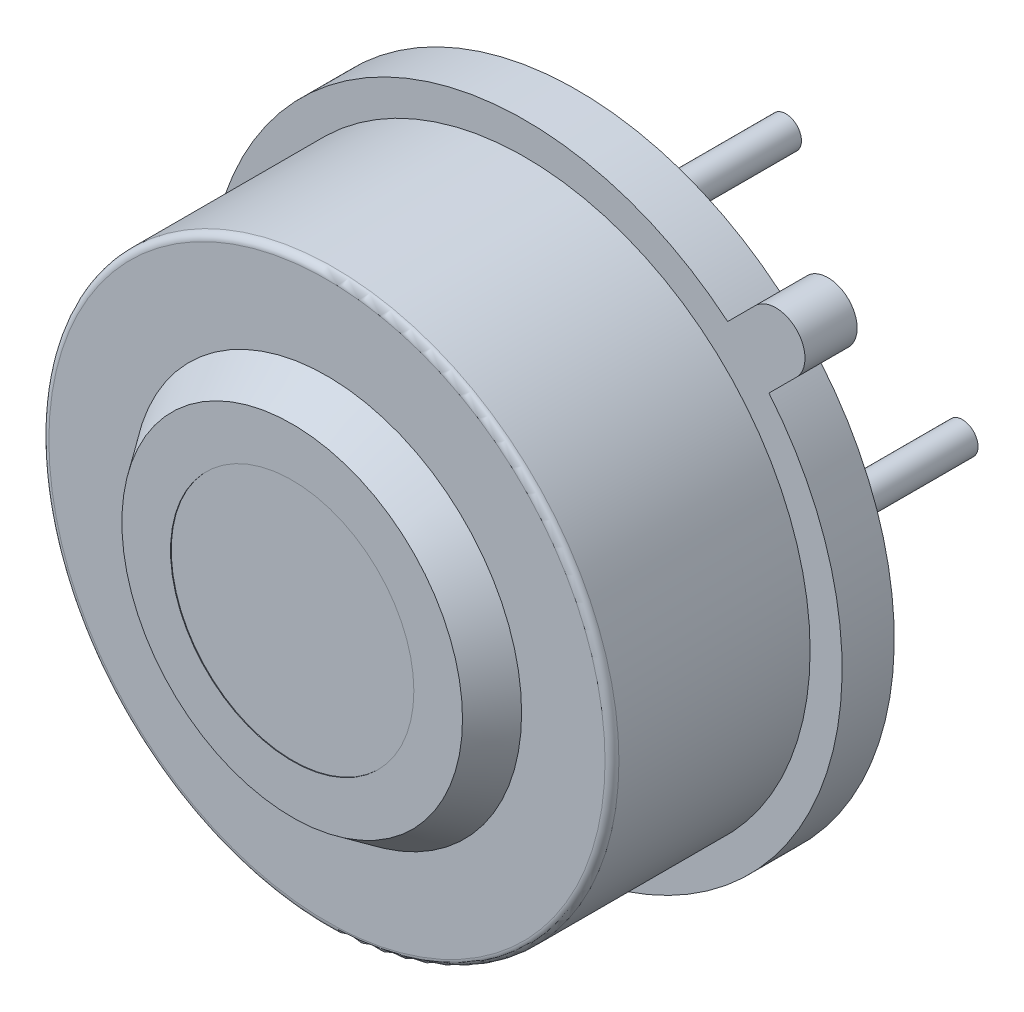
ISO-10303-21;
HEADER;
FILE_DESCRIPTION(('STEP AP214'),'2;1');
FILE_NAME('part.step','',(''),(''),'','','');
FILE_SCHEMA(('AUTOMOTIVE_DESIGN { 1 0 10303 214 1 1 1 1 }'));
ENDSEC;
DATA;
#1=APPLICATION_CONTEXT('core data for automotive mechanical design processes');
#2=APPLICATION_PROTOCOL_DEFINITION('international standard','automotive_design',2000,#1);
#3=PRODUCT_CONTEXT('',#1,'mechanical');
#4=PRODUCT('Part','Part','',(#3));
#5=PRODUCT_RELATED_PRODUCT_CATEGORY('part','',(#4));
#6=PRODUCT_DEFINITION_FORMATION('','',#4);
#7=PRODUCT_DEFINITION_CONTEXT('part definition',#1,'design');
#8=PRODUCT_DEFINITION('design','',#6,#7);
#9=PRODUCT_DEFINITION_SHAPE('','',#8);
#10=(LENGTH_UNIT() NAMED_UNIT(*) SI_UNIT(.MILLI.,.METRE.));
#11=(NAMED_UNIT(*) PLANE_ANGLE_UNIT() SI_UNIT($,.RADIAN.));
#12=(NAMED_UNIT(*) SI_UNIT($,.STERADIAN.) SOLID_ANGLE_UNIT());
#13=UNCERTAINTY_MEASURE_WITH_UNIT(LENGTH_MEASURE(1.E-05),#10,'distance_accuracy_value','');
#14=(GEOMETRIC_REPRESENTATION_CONTEXT(3) GLOBAL_UNCERTAINTY_ASSIGNED_CONTEXT((#13)) GLOBAL_UNIT_ASSIGNED_CONTEXT((#10,
#11,#12)) REPRESENTATION_CONTEXT('',''));
#15=CARTESIAN_POINT('',(0.,0.,0.));
#16=DIRECTION('',(0.,0.,1.));
#17=DIRECTION('',(1.,0.,0.));
#18=AXIS2_PLACEMENT_3D('',#15,#16,#17);
#19=CARTESIAN_POINT('',(0.,0.,0.75));
#20=DIRECTION('',(0.,0.,-1.));
#21=DIRECTION('',(-1.,0.,0.));
#22=AXIS2_PLACEMENT_3D('',#19,#20,#21);
#23=CYLINDRICAL_SURFACE('',#22,4.56);
#24=CARTESIAN_POINT('',(0.,0.,0.));
#25=DIRECTION('',(0.,0.,1.));
#26=DIRECTION('',(-1.,0.,0.));
#27=AXIS2_PLACEMENT_3D('',#24,#25,#26);
#28=CIRCLE('',#27,4.56);
#29=CARTESIAN_POINT('',(2.91371600996987,3.50768570616657,0.));
#30=VERTEX_POINT('',#29);
#31=CARTESIAN_POINT('',(3.50768570616657,2.91371600996987,0.));
#32=VERTEX_POINT('',#31);
#33=EDGE_CURVE('E103',#30,#32,#28,.T.);
#34=ORIENTED_EDGE('',*,*,#33,.T.);
#35=DIRECTION('',(0.,0.,-1.));
#36=VECTOR('',#35,1.);
#37=CARTESIAN_POINT('',(3.50768570616657,2.91371600996987,0.75));
#38=LINE('',#37,#36);
#39=CARTESIAN_POINT('',(3.50768570616657,2.91371600996987,0.75));
#40=VERTEX_POINT('',#39);
#41=EDGE_CURVE('E94',#40,#32,#38,.T.);
#42=ORIENTED_EDGE('',*,*,#41,.F.);
#43=CARTESIAN_POINT('',(0.,0.,0.75));
#44=DIRECTION('',(0.,0.,1.));
#45=DIRECTION('',(-1.,0.,0.));
#46=AXIS2_PLACEMENT_3D('',#43,#44,#45);
#47=CIRCLE('',#46,4.56);
#48=CARTESIAN_POINT('',(2.91371600996987,3.50768570616657,0.75));
#49=VERTEX_POINT('',#48);
#50=EDGE_CURVE('E88',#49,#40,#47,.T.);
#51=ORIENTED_EDGE('',*,*,#50,.F.);
#52=DIRECTION('',(0.,0.,-1.));
#53=VECTOR('',#52,1.);
#54=CARTESIAN_POINT('',(2.91371600996987,3.50768570616657,0.75));
#55=LINE('',#54,#53);
#56=EDGE_CURVE('E99',#49,#30,#55,.T.);
#57=ORIENTED_EDGE('',*,*,#56,.T.);
#58=EDGE_LOOP('',(#34,#42,#51,#57));
#59=FACE_BOUND('',#58,.T.);
#60=ADVANCED_FACE('F35',(#59),#23,.T.);
#61=CARTESIAN_POINT('',(3.50768570616657,2.91371600996987,0.75));
#62=DIRECTION('',(-0.707106781186547,0.707106781186548,0.));
#63=DIRECTION('',(-0.707106781186548,-0.707106781186547,0.));
#64=AXIS2_PLACEMENT_3D('',#61,#62,#63);
#65=PLANE('',#64);
#66=DIRECTION('',(0.707106781186548,0.707106781186547,0.));
#67=VECTOR('',#66,1.);
#68=CARTESIAN_POINT('',(3.50768570616657,2.91371600996987,0.));
#69=LINE('',#68,#67);
#70=CARTESIAN_POINT('',(3.90322943214974,3.30925973595304,0.));
#71=VERTEX_POINT('',#70);
#72=EDGE_CURVE('E93',#32,#71,#69,.T.);
#73=ORIENTED_EDGE('',*,*,#72,.T.);
#74=DIRECTION('',(0.,0.,-1.));
#75=VECTOR('',#74,1.);
#76=CARTESIAN_POINT('',(3.90322943214974,3.30925973595304,0.75));
#77=LINE('',#76,#75);
#78=CARTESIAN_POINT('',(3.90322943214974,3.30925973595304,0.75));
#79=VERTEX_POINT('',#78);
#80=EDGE_CURVE('E91',#79,#71,#77,.T.);
#81=ORIENTED_EDGE('',*,*,#80,.F.);
#82=DIRECTION('',(0.707106781186548,0.707106781186547,0.));
#83=VECTOR('',#82,1.);
#84=CARTESIAN_POINT('',(3.50768570616657,2.91371600996987,0.75));
#85=LINE('',#84,#83);
#86=EDGE_CURVE('E83',#40,#79,#85,.T.);
#87=ORIENTED_EDGE('',*,*,#86,.F.);
#88=ORIENTED_EDGE('',*,*,#41,.T.);
#89=EDGE_LOOP('',(#73,#81,#87,#88));
#90=FACE_BOUND('',#89,.T.);
#91=ADVANCED_FACE('F92',(#90),#65,.F.);
#92=CARTESIAN_POINT('',(3.60624458405139,3.60624458405139,0.75));
#93=DIRECTION('',(0.,0.,-1.));
#94=DIRECTION('',(-1.,0.,0.));
#95=AXIS2_PLACEMENT_3D('',#92,#93,#94);
#96=CYLINDRICAL_SURFACE('',#95,0.42);
#97=CARTESIAN_POINT('',(3.60624458405139,3.60624458405139,0.));
#98=DIRECTION('',(0.,0.,1.));
#99=DIRECTION('',(-1.,0.,0.));
#100=AXIS2_PLACEMENT_3D('',#97,#98,#99);
#101=CIRCLE('',#100,0.42);
#102=CARTESIAN_POINT('',(3.30925973595304,3.90322943214974,0.));
#103=VERTEX_POINT('',#102);
#104=EDGE_CURVE('E69',#71,#103,#101,.T.);
#105=ORIENTED_EDGE('',*,*,#104,.T.);
#106=DIRECTION('',(0.,0.,-1.));
#107=VECTOR('',#106,1.);
#108=CARTESIAN_POINT('',(3.30925973595304,3.90322943214974,0.75));
#109=LINE('',#108,#107);
#110=CARTESIAN_POINT('',(3.30925973595304,3.90322943214974,0.75));
#111=VERTEX_POINT('',#110);
#112=EDGE_CURVE('E95',#111,#103,#109,.T.);
#113=ORIENTED_EDGE('',*,*,#112,.F.);
#114=CARTESIAN_POINT('',(3.60624458405139,3.60624458405139,0.75));
#115=DIRECTION('',(0.,0.,1.));
#116=DIRECTION('',(-1.,0.,0.));
#117=AXIS2_PLACEMENT_3D('',#114,#115,#116);
#118=CIRCLE('',#117,0.42);
#119=EDGE_CURVE('E86',#79,#111,#118,.T.);
#120=ORIENTED_EDGE('',*,*,#119,.F.);
#121=ORIENTED_EDGE('',*,*,#80,.T.);
#122=EDGE_LOOP('',(#105,#113,#120,#121));
#123=FACE_BOUND('',#122,.T.);
#124=ADVANCED_FACE('F97',(#123),#96,.T.);
#125=CARTESIAN_POINT('',(2.91371600996987,3.50768570616657,0.75));
#126=DIRECTION('',(0.707106781186547,-0.707106781186548,0.));
#127=DIRECTION('',(0.707106781186548,0.707106781186547,0.));
#128=AXIS2_PLACEMENT_3D('',#125,#126,#127);
#129=PLANE('',#128);
#130=DIRECTION('',(-0.707106781186548,-0.707106781186547,0.));
#131=VECTOR('',#130,1.);
#132=CARTESIAN_POINT('',(2.91371600996987,3.50768570616657,0.));
#133=LINE('',#132,#131);
#134=EDGE_CURVE('E75',#103,#30,#133,.T.);
#135=ORIENTED_EDGE('',*,*,#134,.T.);
#136=ORIENTED_EDGE('',*,*,#56,.F.);
#137=DIRECTION('',(-0.707106781186548,-0.707106781186547,0.));
#138=VECTOR('',#137,1.);
#139=CARTESIAN_POINT('',(2.91371600996987,3.50768570616657,0.75));
#140=LINE('',#139,#138);
#141=EDGE_CURVE('E52',#111,#49,#140,.T.);
#142=ORIENTED_EDGE('',*,*,#141,.F.);
#143=ORIENTED_EDGE('',*,*,#112,.T.);
#144=EDGE_LOOP('',(#135,#136,#142,#143));
#145=FACE_BOUND('',#144,.T.);
#146=ADVANCED_FACE('F192',(#145),#129,.F.);
#147=CARTESIAN_POINT('',(0.,0.,0.75));
#148=DIRECTION('',(0.,0.,-1.));
#149=DIRECTION('',(-1.,0.,0.));
#150=AXIS2_PLACEMENT_3D('',#147,#148,#149);
#151=PLANE('',#150);
#152=CARTESIAN_POINT('',(0.,0.,0.75));
#153=DIRECTION('',(0.,0.,1.));
#154=DIRECTION('',(1.,0.,0.));
#155=AXIS2_PLACEMENT_3D('',#152,#153,#154);
#156=CIRCLE('',#155,4.1);
#157=CARTESIAN_POINT('',(4.1,0.,0.75));
#158=VERTEX_POINT('',#157);
#159=EDGE_CURVE('E113',#158,#158,#156,.T.);
#160=ORIENTED_EDGE('',*,*,#159,.F.);
#161=EDGE_LOOP('',(#160));
#162=FACE_BOUND('',#161,.T.);
#163=ORIENTED_EDGE('',*,*,#50,.T.);
#164=ORIENTED_EDGE('',*,*,#86,.T.);
#165=ORIENTED_EDGE('',*,*,#119,.T.);
#166=ORIENTED_EDGE('',*,*,#141,.T.);
#167=EDGE_LOOP('',(#163,#164,#165,#166));
#168=FACE_BOUND('',#167,.T.);
#169=ADVANCED_FACE('F84',(#162,#168),#151,.F.);
#170=CARTESIAN_POINT('',(0.,0.,0.));
#171=DIRECTION('',(0.,0.,-1.));
#172=DIRECTION('',(-1.,0.,0.));
#173=AXIS2_PLACEMENT_3D('',#170,#171,#172);
#174=PLANE('',#173);
#175=CARTESIAN_POINT('',(0.,2.54,0.));
#176=DIRECTION('',(0.,0.,-1.));
#177=DIRECTION('',(-1.,0.,0.));
#178=AXIS2_PLACEMENT_3D('',#175,#176,#177);
#179=CIRCLE('',#178,0.225);
#180=CARTESIAN_POINT('',(-0.225,2.54,0.));
#181=VERTEX_POINT('',#180);
#182=EDGE_CURVE('E165',#181,#181,#179,.T.);
#183=ORIENTED_EDGE('',*,*,#182,.F.);
#184=EDGE_LOOP('',(#183));
#185=FACE_BOUND('',#184,.T.);
#186=CARTESIAN_POINT('',(-2.54,0.,0.));
#187=DIRECTION('',(0.,0.,-1.));
#188=DIRECTION('',(-1.,0.,0.));
#189=AXIS2_PLACEMENT_3D('',#186,#187,#188);
#190=CIRCLE('',#189,0.225);
#191=CARTESIAN_POINT('',(-2.765,0.,0.));
#192=VERTEX_POINT('',#191);
#193=EDGE_CURVE('E159',#192,#192,#190,.T.);
#194=ORIENTED_EDGE('',*,*,#193,.F.);
#195=EDGE_LOOP('',(#194));
#196=FACE_BOUND('',#195,.T.);
#197=CARTESIAN_POINT('',(0.,-2.54,0.));
#198=DIRECTION('',(0.,0.,-1.));
#199=DIRECTION('',(-1.,0.,0.));
#200=AXIS2_PLACEMENT_3D('',#197,#198,#199);
#201=CIRCLE('',#200,0.225);
#202=CARTESIAN_POINT('',(-0.225,-2.54,0.));
#203=VERTEX_POINT('',#202);
#204=EDGE_CURVE('E153',#203,#203,#201,.T.);
#205=ORIENTED_EDGE('',*,*,#204,.F.);
#206=EDGE_LOOP('',(#205));
#207=FACE_BOUND('',#206,.T.);
#208=CARTESIAN_POINT('',(2.54,0.,0.));
#209=DIRECTION('',(0.,0.,-1.));
#210=DIRECTION('',(-1.,0.,0.));
#211=AXIS2_PLACEMENT_3D('',#208,#209,#210);
#212=CIRCLE('',#211,0.225);
#213=CARTESIAN_POINT('',(2.315,0.,0.));
#214=VERTEX_POINT('',#213);
#215=EDGE_CURVE('E147',#214,#214,#212,.T.);
#216=ORIENTED_EDGE('',*,*,#215,.F.);
#217=EDGE_LOOP('',(#216));
#218=FACE_BOUND('',#217,.T.);
#219=ORIENTED_EDGE('',*,*,#33,.F.);
#220=ORIENTED_EDGE('',*,*,#134,.F.);
#221=ORIENTED_EDGE('',*,*,#104,.F.);
#222=ORIENTED_EDGE('',*,*,#72,.F.);
#223=EDGE_LOOP('',(#219,#220,#221,#222));
#224=FACE_BOUND('',#223,.T.);
#225=ADVANCED_FACE('F180',(#185,#196,#207,#218,#224),#174,.T.);
#226=CARTESIAN_POINT('',(0.,0.,3.6));
#227=DIRECTION('',(0.,0.,-1.));
#228=DIRECTION('',(-1.,0.,0.));
#229=AXIS2_PLACEMENT_3D('',#226,#227,#228);
#230=CYLINDRICAL_SURFACE('',#229,4.1);
#231=CARTESIAN_POINT('',(0.,0.,3.5));
#232=DIRECTION('',(0.,0.,1.));
#233=DIRECTION('',(1.,0.,0.));
#234=AXIS2_PLACEMENT_3D('',#231,#232,#233);
#235=CIRCLE('',#234,4.1);
#236=CARTESIAN_POINT('',(4.1,0.,3.5));
#237=VERTEX_POINT('',#236);
#238=EDGE_CURVE('E44',#237,#237,#235,.F.);
#239=ORIENTED_EDGE('',*,*,#238,.T.);
#240=EDGE_LOOP('',(#239));
#241=FACE_BOUND('',#240,.T.);
#242=ORIENTED_EDGE('',*,*,#159,.T.);
#243=EDGE_LOOP('',(#242));
#244=FACE_BOUND('',#243,.T.);
#245=ADVANCED_FACE('F120',(#241,#244),#230,.T.);
#246=CARTESIAN_POINT('',(0.,0.,3.6));
#247=DIRECTION('',(0.,0.,1.));
#248=DIRECTION('',(1.,0.,0.));
#249=AXIS2_PLACEMENT_3D('',#246,#247,#248);
#250=PLANE('',#249);
#251=CARTESIAN_POINT('',(0.,0.,3.6));
#252=DIRECTION('',(0.,0.,1.));
#253=DIRECTION('',(1.,0.,0.));
#254=AXIS2_PLACEMENT_3D('',#251,#252,#253);
#255=CIRCLE('',#254,4.);
#256=CARTESIAN_POINT('',(4.,0.,3.6));
#257=VERTEX_POINT('',#256);
#258=EDGE_CURVE('E114',#257,#257,#255,.T.);
#259=ORIENTED_EDGE('',*,*,#258,.T.);
#260=EDGE_LOOP('',(#259));
#261=FACE_BOUND('',#260,.T.);
#262=CARTESIAN_POINT('',(0.,0.,3.6));
#263=DIRECTION('',(0.,0.,1.));
#264=DIRECTION('',(1.,0.,0.));
#265=AXIS2_PLACEMENT_3D('',#262,#263,#264);
#266=CIRCLE('',#265,2.8);
#267=CARTESIAN_POINT('',(2.8,0.,3.6));
#268=VERTEX_POINT('',#267);
#269=EDGE_CURVE('E116',#268,#268,#266,.T.);
#270=ORIENTED_EDGE('',*,*,#269,.F.);
#271=EDGE_LOOP('',(#270));
#272=FACE_BOUND('',#271,.T.);
#273=ADVANCED_FACE('F129',(#261,#272),#250,.T.);
#274=CARTESIAN_POINT('',(0.,0.,4.1));
#275=DIRECTION('',(0.,0.,1.));
#276=DIRECTION('',(1.,0.,0.));
#277=AXIS2_PLACEMENT_3D('',#274,#275,#276);
#278=PLANE('',#277);
#279=CARTESIAN_POINT('',(0.,0.,4.1));
#280=DIRECTION('',(0.,0.,1.));
#281=DIRECTION('',(1.,0.,0.));
#282=AXIS2_PLACEMENT_3D('',#279,#280,#281);
#283=CIRCLE('',#282,2.44989623089515);
#284=CARTESIAN_POINT('',(2.44989623089515,0.,4.1));
#285=VERTEX_POINT('',#284);
#286=EDGE_CURVE('E11',#285,#285,#283,.T.);
#287=ORIENTED_EDGE('',*,*,#286,.T.);
#288=EDGE_LOOP('',(#287));
#289=FACE_BOUND('',#288,.T.);
#290=CARTESIAN_POINT('',(0.,0.,4.1));
#291=DIRECTION('',(0.,0.,1.));
#292=DIRECTION('',(1.,0.,0.));
#293=AXIS2_PLACEMENT_3D('',#290,#291,#292);
#294=CIRCLE('',#293,1.75);
#295=CARTESIAN_POINT('',(1.75,0.,4.1));
#296=VERTEX_POINT('',#295);
#297=EDGE_CURVE('E141',#296,#296,#294,.T.);
#298=ORIENTED_EDGE('',*,*,#297,.F.);
#299=EDGE_LOOP('',(#298));
#300=FACE_BOUND('',#299,.T.);
#301=ADVANCED_FACE('F132',(#289,#300),#278,.T.);
#302=CARTESIAN_POINT('',(0.,0.,4.09));
#303=DIRECTION('',(0.,0.,1.));
#304=DIRECTION('',(1.,0.,0.));
#305=AXIS2_PLACEMENT_3D('',#302,#303,#304);
#306=CYLINDRICAL_SURFACE('',#305,1.75);
#307=CARTESIAN_POINT('',(0.,0.,4.09));
#308=DIRECTION('',(0.,0.,1.));
#309=DIRECTION('',(1.,0.,0.));
#310=AXIS2_PLACEMENT_3D('',#307,#308,#309);
#311=CIRCLE('',#310,1.75);
#312=CARTESIAN_POINT('',(1.75,0.,4.09));
#313=VERTEX_POINT('',#312);
#314=EDGE_CURVE('E106',#313,#313,#311,.T.);
#315=CARTESIAN_POINT('',(1.75,0.,4.09));
#316=CARTESIAN_POINT('',(1.75,0.,4.09010416666667));
#317=CARTESIAN_POINT('',(1.75,0.,4.09020833333333));
#318=CARTESIAN_POINT('',(1.75,0.,4.09041666666667));
#319=CARTESIAN_POINT('',(1.75,0.,4.09052083333333));
#320=CARTESIAN_POINT('',(1.75,0.,4.09072916666667));
#321=CARTESIAN_POINT('',(1.75,0.,4.09083333333333));
#322=CARTESIAN_POINT('',(1.75,0.,4.09104166666667));
#323=CARTESIAN_POINT('',(1.75,0.,4.09114583333333));
#324=CARTESIAN_POINT('',(1.75,0.,4.09135416666667));
#325=CARTESIAN_POINT('',(1.75,0.,4.09145833333333));
#326=CARTESIAN_POINT('',(1.75,0.,4.09166666666667));
#327=CARTESIAN_POINT('',(1.75,0.,4.09177083333333));
#328=CARTESIAN_POINT('',(1.75,0.,4.09197916666667));
#329=CARTESIAN_POINT('',(1.75,0.,4.09208333333333));
#330=CARTESIAN_POINT('',(1.75,0.,4.09229166666667));
#331=CARTESIAN_POINT('',(1.75,0.,4.09239583333333));
#332=CARTESIAN_POINT('',(1.75,0.,4.09260416666667));
#333=CARTESIAN_POINT('',(1.75,0.,4.09270833333333));
#334=CARTESIAN_POINT('',(1.75,0.,4.09291666666667));
#335=CARTESIAN_POINT('',(1.75,0.,4.09302083333333));
#336=CARTESIAN_POINT('',(1.75,0.,4.09322916666667));
#337=CARTESIAN_POINT('',(1.75,0.,4.09333333333333));
#338=CARTESIAN_POINT('',(1.75,0.,4.09354166666667));
#339=CARTESIAN_POINT('',(1.75,0.,4.09364583333333));
#340=CARTESIAN_POINT('',(1.75,0.,4.09385416666667));
#341=CARTESIAN_POINT('',(1.75,0.,4.09395833333333));
#342=CARTESIAN_POINT('',(1.75,0.,4.09416666666667));
#343=CARTESIAN_POINT('',(1.75,0.,4.09427083333333));
#344=CARTESIAN_POINT('',(1.75,0.,4.09447916666667));
#345=CARTESIAN_POINT('',(1.75,0.,4.09458333333333));
#346=CARTESIAN_POINT('',(1.75,0.,4.09479166666667));
#347=CARTESIAN_POINT('',(1.75,0.,4.09489583333333));
#348=CARTESIAN_POINT('',(1.75,0.,4.09510416666667));
#349=CARTESIAN_POINT('',(1.75,0.,4.09520833333333));
#350=CARTESIAN_POINT('',(1.75,0.,4.09541666666667));
#351=CARTESIAN_POINT('',(1.75,0.,4.09552083333333));
#352=CARTESIAN_POINT('',(1.75,0.,4.09572916666667));
#353=CARTESIAN_POINT('',(1.75,0.,4.09583333333333));
#354=CARTESIAN_POINT('',(1.75,0.,4.09604166666667));
#355=CARTESIAN_POINT('',(1.75,0.,4.09614583333333));
#356=CARTESIAN_POINT('',(1.75,0.,4.09635416666667));
#357=CARTESIAN_POINT('',(1.75,0.,4.09645833333333));
#358=CARTESIAN_POINT('',(1.75,0.,4.09666666666667));
#359=CARTESIAN_POINT('',(1.75,0.,4.09677083333333));
#360=CARTESIAN_POINT('',(1.75,0.,4.09697916666667));
#361=CARTESIAN_POINT('',(1.75,0.,4.09708333333333));
#362=CARTESIAN_POINT('',(1.75,0.,4.09729166666667));
#363=CARTESIAN_POINT('',(1.75,0.,4.09739583333333));
#364=CARTESIAN_POINT('',(1.75,0.,4.09760416666666));
#365=CARTESIAN_POINT('',(1.75,0.,4.09770833333333));
#366=CARTESIAN_POINT('',(1.75,0.,4.09791666666667));
#367=CARTESIAN_POINT('',(1.75,0.,4.09802083333333));
#368=CARTESIAN_POINT('',(1.75,0.,4.09822916666667));
#369=CARTESIAN_POINT('',(1.75,0.,4.09833333333333));
#370=CARTESIAN_POINT('',(1.75,0.,4.09854166666666));
#371=CARTESIAN_POINT('',(1.75,0.,4.09864583333333));
#372=CARTESIAN_POINT('',(1.75,0.,4.09885416666667));
#373=CARTESIAN_POINT('',(1.75,0.,4.09895833333333));
#374=CARTESIAN_POINT('',(1.75,0.,4.09916666666667));
#375=CARTESIAN_POINT('',(1.75,0.,4.09927083333333));
#376=CARTESIAN_POINT('',(1.75,0.,4.09947916666667));
#377=CARTESIAN_POINT('',(1.75,0.,4.09958333333333));
#378=CARTESIAN_POINT('',(1.75,0.,4.09979166666667));
#379=CARTESIAN_POINT('',(1.75,0.,4.09989583333333));
#380=CARTESIAN_POINT('',(1.75,0.,4.1));
#381=B_SPLINE_CURVE_WITH_KNOTS('',3,(#315,#316,#317,#318,#319,#320,#321,#322,#323,#324,#325,
#326,#327,#328,#329,#330,#331,#332,#333,#334,#335,#336,#337,#338,#339,#340,#341,#342,#343,#344,
#345,#346,#347,#348,#349,#350,#351,#352,#353,#354,#355,#356,#357,#358,#359,#360,#361,#362,#363,
#364,#365,#366,#367,#368,#369,#370,#371,#372,#373,#374,#375,#376,#377,#378,#379,#380),
.UNSPECIFIED.,.F.,.F.,(4,2,2,2,2,2,2,2,2,2,2,2,2,2,2,2,2,2,2,2,2,2,2,2,2,2,2,2,2,2,2,2,4),(0.,
0.000312500000000313,0.000625000000000625,0.00093750000000007,0.00125000000000038,
0.0015625000000007,0.00187500000000014,0.00218750000000045,0.0024999999999999,
0.00281250000000021,0.00312500000000052,0.00343749999999997,0.00375000000000028,
0.00406250000000059,0.00437500000000004,0.00468750000000035,0.0049999999999998,
0.00531250000000011,0.00562500000000042,0.00593749999999987,0.00625000000000018,
0.00656250000000049,0.00687499999999994,0.00718750000000025,0.00749999999999969,
0.00781250000000001,0.00812500000000032,0.00843749999999976,0.00875000000000008,
0.00906250000000039,0.00937499999999983,0.00968750000000015,0.00999999999999959),.UNSPECIFIED.);
#382=EDGE_CURVE('BSEAM230',#313,#296,#381,.T.);
#383=ORIENTED_EDGE('',*,*,#314,.F.);
#384=ORIENTED_EDGE('',*,*,#297,.T.);
#385=ORIENTED_EDGE('',*,*,#382,.T.);
#386=ORIENTED_EDGE('',*,*,#382,.F.);
#387=EDGE_LOOP('',(#383,#385,#384,#386));
#388=FACE_BOUND('',#387,.T.);
#389=ADVANCED_FACE('F230',(#388),#306,.F.);
#390=CARTESIAN_POINT('',(0.,0.,4.09));
#391=DIRECTION('',(0.,0.,1.));
#392=DIRECTION('',(1.,0.,0.));
#393=AXIS2_PLACEMENT_3D('',#390,#391,#392);
#394=PLANE('',#393);
#395=ORIENTED_EDGE('',*,*,#314,.T.);
#396=EDGE_LOOP('',(#395));
#397=FACE_BOUND('',#396,.T.);
#398=ADVANCED_FACE('F126',(#397),#394,.T.);
#399=CARTESIAN_POINT('',(0.,0.,3.5));
#400=DIRECTION('',(0.,0.,1.));
#401=DIRECTION('',(1.,0.,0.));
#402=AXIS2_PLACEMENT_3D('',#399,#400,#401);
#403=TOROIDAL_SURFACE('',#402,4.,0.1);
#404=ORIENTED_EDGE('',*,*,#238,.F.);
#405=EDGE_LOOP('',(#404));
#406=FACE_BOUND('',#405,.T.);
#407=ORIENTED_EDGE('',*,*,#258,.F.);
#408=EDGE_LOOP('',(#407));
#409=FACE_BOUND('',#408,.T.);
#410=ADVANCED_FACE('F123',(#406,#409),#403,.T.);
#411=CARTESIAN_POINT('',(0.,0.,4.1));
#412=DIRECTION('',(0.,0.,-1.));
#413=DIRECTION('',(-1.,0.,0.));
#414=AXIS2_PLACEMENT_3D('',#411,#412,#413);
#415=CONICAL_SURFACE('',#414,2.44989623089515,0.610865238198012);
#416=ORIENTED_EDGE('',*,*,#269,.T.);
#417=EDGE_LOOP('',(#416));
#418=FACE_BOUND('',#417,.T.);
#419=ORIENTED_EDGE('',*,*,#286,.F.);
#420=EDGE_LOOP('',(#419));
#421=FACE_BOUND('',#420,.T.);
#422=ADVANCED_FACE('F37',(#418,#421),#415,.T.);
#423=CARTESIAN_POINT('',(2.54,0.,-3.));
#424=DIRECTION('',(0.,0.,1.));
#425=DIRECTION('',(1.,0.,0.));
#426=AXIS2_PLACEMENT_3D('',#423,#424,#425);
#427=CYLINDRICAL_SURFACE('',#426,0.225);
#428=CARTESIAN_POINT('',(2.54,0.,-3.));
#429=DIRECTION('',(0.,0.,-1.));
#430=DIRECTION('',(-1.,0.,0.));
#431=AXIS2_PLACEMENT_3D('',#428,#429,#430);
#432=CIRCLE('',#431,0.225);
#433=CARTESIAN_POINT('',(2.315,0.,-3.));
#434=VERTEX_POINT('',#433);
#435=EDGE_CURVE('E144',#434,#434,#432,.T.);
#436=ORIENTED_EDGE('',*,*,#435,.F.);
#437=EDGE_LOOP('',(#436));
#438=FACE_BOUND('',#437,.T.);
#439=ORIENTED_EDGE('',*,*,#215,.T.);
#440=EDGE_LOOP('',(#439));
#441=FACE_BOUND('',#440,.T.);
#442=ADVANCED_FACE('F282',(#438,#441),#427,.T.);
#443=CARTESIAN_POINT('',(2.54,0.,-3.));
#444=DIRECTION('',(0.,0.,-1.));
#445=DIRECTION('',(-1.,0.,0.));
#446=AXIS2_PLACEMENT_3D('',#443,#444,#445);
#447=PLANE('',#446);
#448=ORIENTED_EDGE('',*,*,#435,.T.);
#449=EDGE_LOOP('',(#448));
#450=FACE_BOUND('',#449,.T.);
#451=ADVANCED_FACE('F295',(#450),#447,.T.);
#452=CARTESIAN_POINT('',(0.,-2.54,-3.));
#453=DIRECTION('',(0.,0.,1.));
#454=DIRECTION('',(1.,0.,0.));
#455=AXIS2_PLACEMENT_3D('',#452,#453,#454);
#456=CYLINDRICAL_SURFACE('',#455,0.225);
#457=CARTESIAN_POINT('',(0.,-2.54,-3.));
#458=DIRECTION('',(0.,0.,-1.));
#459=DIRECTION('',(-1.,0.,0.));
#460=AXIS2_PLACEMENT_3D('',#457,#458,#459);
#461=CIRCLE('',#460,0.225);
#462=CARTESIAN_POINT('',(-0.225,-2.54,-3.));
#463=VERTEX_POINT('',#462);
#464=EDGE_CURVE('E150',#463,#463,#461,.T.);
#465=ORIENTED_EDGE('',*,*,#464,.F.);
#466=EDGE_LOOP('',(#465));
#467=FACE_BOUND('',#466,.T.);
#468=ORIENTED_EDGE('',*,*,#204,.T.);
#469=EDGE_LOOP('',(#468));
#470=FACE_BOUND('',#469,.T.);
#471=ADVANCED_FACE('F305',(#467,#470),#456,.T.);
#472=CARTESIAN_POINT('',(0.,-2.54,-3.));
#473=DIRECTION('',(0.,0.,-1.));
#474=DIRECTION('',(-1.,0.,0.));
#475=AXIS2_PLACEMENT_3D('',#472,#473,#474);
#476=PLANE('',#475);
#477=ORIENTED_EDGE('',*,*,#464,.T.);
#478=EDGE_LOOP('',(#477));
#479=FACE_BOUND('',#478,.T.);
#480=ADVANCED_FACE('F315',(#479),#476,.T.);
#481=CARTESIAN_POINT('',(-2.54,0.,-3.));
#482=DIRECTION('',(0.,0.,1.));
#483=DIRECTION('',(1.,0.,0.));
#484=AXIS2_PLACEMENT_3D('',#481,#482,#483);
#485=CYLINDRICAL_SURFACE('',#484,0.225);
#486=CARTESIAN_POINT('',(-2.54,0.,-3.));
#487=DIRECTION('',(0.,0.,-1.));
#488=DIRECTION('',(-1.,0.,0.));
#489=AXIS2_PLACEMENT_3D('',#486,#487,#488);
#490=CIRCLE('',#489,0.225);
#491=CARTESIAN_POINT('',(-2.765,0.,-3.));
#492=VERTEX_POINT('',#491);
#493=EDGE_CURVE('E156',#492,#492,#490,.T.);
#494=ORIENTED_EDGE('',*,*,#493,.F.);
#495=EDGE_LOOP('',(#494));
#496=FACE_BOUND('',#495,.T.);
#497=ORIENTED_EDGE('',*,*,#193,.T.);
#498=EDGE_LOOP('',(#497));
#499=FACE_BOUND('',#498,.T.);
#500=ADVANCED_FACE('F325',(#496,#499),#485,.T.);
#501=CARTESIAN_POINT('',(-2.54,0.,-3.));
#502=DIRECTION('',(0.,0.,-1.));
#503=DIRECTION('',(-1.,0.,0.));
#504=AXIS2_PLACEMENT_3D('',#501,#502,#503);
#505=PLANE('',#504);
#506=ORIENTED_EDGE('',*,*,#493,.T.);
#507=EDGE_LOOP('',(#506));
#508=FACE_BOUND('',#507,.T.);
#509=ADVANCED_FACE('F176',(#508),#505,.T.);
#510=CARTESIAN_POINT('',(0.,2.54,-3.));
#511=DIRECTION('',(0.,0.,1.));
#512=DIRECTION('',(1.,0.,0.));
#513=AXIS2_PLACEMENT_3D('',#510,#511,#512);
#514=CYLINDRICAL_SURFACE('',#513,0.225);
#515=CARTESIAN_POINT('',(0.,2.54,-3.));
#516=DIRECTION('',(0.,0.,-1.));
#517=DIRECTION('',(-1.,0.,0.));
#518=AXIS2_PLACEMENT_3D('',#515,#516,#517);
#519=CIRCLE('',#518,0.225);
#520=CARTESIAN_POINT('',(-0.225,2.54,-3.));
#521=VERTEX_POINT('',#520);
#522=EDGE_CURVE('E162',#521,#521,#519,.T.);
#523=ORIENTED_EDGE('',*,*,#522,.F.);
#524=EDGE_LOOP('',(#523));
#525=FACE_BOUND('',#524,.T.);
#526=ORIENTED_EDGE('',*,*,#182,.T.);
#527=EDGE_LOOP('',(#526));
#528=FACE_BOUND('',#527,.T.);
#529=ADVANCED_FACE('F173',(#525,#528),#514,.T.);
#530=CARTESIAN_POINT('',(0.,2.54,-3.));
#531=DIRECTION('',(0.,0.,-1.));
#532=DIRECTION('',(-1.,0.,0.));
#533=AXIS2_PLACEMENT_3D('',#530,#531,#532);
#534=PLANE('',#533);
#535=ORIENTED_EDGE('',*,*,#522,.T.);
#536=EDGE_LOOP('',(#535));
#537=FACE_BOUND('',#536,.T.);
#538=ADVANCED_FACE('F171',(#537),#534,.T.);
#539=CLOSED_SHELL('',(#60,#91,#124,#146,#169,#225,#245,#273,#301,#389,#398,#410,#422,#442,#451,
#471,#480,#500,#509,#529,#538));
#540=MANIFOLD_SOLID_BREP('B2',#539);
#541=ADVANCED_BREP_SHAPE_REPRESENTATION('',(#18,#540),#14);
#542=SHAPE_DEFINITION_REPRESENTATION(#9,#541);
ENDSEC;
END-ISO-10303-21;
